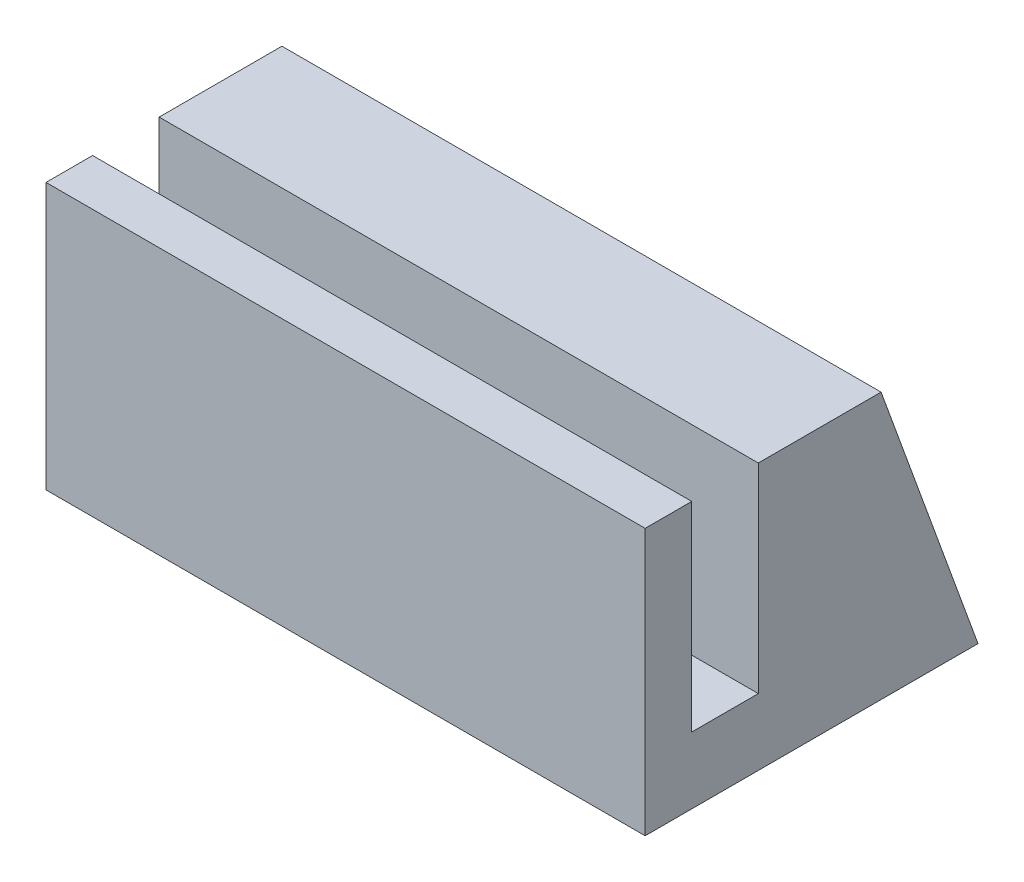
ISO-10303-21;
HEADER;
FILE_DESCRIPTION(('STEP AP214'),'2;1');
FILE_NAME('part.step','',(''),(''),'','','');
FILE_SCHEMA(('AUTOMOTIVE_DESIGN { 1 0 10303 214 1 1 1 1 }'));
ENDSEC;
DATA;
#1=APPLICATION_CONTEXT('core data for automotive mechanical design processes');
#2=APPLICATION_PROTOCOL_DEFINITION('international standard','automotive_design',2000,#1);
#3=PRODUCT_CONTEXT('',#1,'mechanical');
#4=PRODUCT('Part','Part','',(#3));
#5=PRODUCT_RELATED_PRODUCT_CATEGORY('part','',(#4));
#6=PRODUCT_DEFINITION_FORMATION('','',#4);
#7=PRODUCT_DEFINITION_CONTEXT('part definition',#1,'design');
#8=PRODUCT_DEFINITION('design','',#6,#7);
#9=PRODUCT_DEFINITION_SHAPE('','',#8);
#10=(LENGTH_UNIT() NAMED_UNIT(*) SI_UNIT(.MILLI.,.METRE.));
#11=(NAMED_UNIT(*) PLANE_ANGLE_UNIT() SI_UNIT($,.RADIAN.));
#12=(NAMED_UNIT(*) SI_UNIT($,.STERADIAN.) SOLID_ANGLE_UNIT());
#13=UNCERTAINTY_MEASURE_WITH_UNIT(LENGTH_MEASURE(1.E-05),#10,'distance_accuracy_value','');
#14=(GEOMETRIC_REPRESENTATION_CONTEXT(3) GLOBAL_UNCERTAINTY_ASSIGNED_CONTEXT((#13)) GLOBAL_UNIT_ASSIGNED_CONTEXT((#10,
#11,#12)) REPRESENTATION_CONTEXT('',''));
#15=CARTESIAN_POINT('',(0.,0.,0.));
#16=DIRECTION('',(0.,0.,1.));
#17=DIRECTION('',(1.,0.,0.));
#18=AXIS2_PLACEMENT_3D('',#15,#16,#17);
#19=CARTESIAN_POINT('',(22.5,-10.,25.));
#20=DIRECTION('',(-1.,0.,0.));
#21=DIRECTION('',(0.,0.,1.));
#22=AXIS2_PLACEMENT_3D('',#19,#20,#21);
#23=PLANE('',#22);
#24=DIRECTION('',(0.,0.,-1.));
#25=VECTOR('',#24,1.);
#26=CARTESIAN_POINT('',(22.5,-10.,25.));
#27=LINE('',#26,#25);
#28=CARTESIAN_POINT('',(22.5,-10.,25.));
#29=VERTEX_POINT('',#28);
#30=CARTESIAN_POINT('',(22.5,-10.,0.));
#31=VERTEX_POINT('',#30);
#32=EDGE_CURVE('E235',#29,#31,#27,.T.);
#33=ORIENTED_EDGE('',*,*,#32,.T.);
#34=DIRECTION('',(0.,-0.939683630956786,-0.34204484166827));
#35=VECTOR('',#34,1.);
#36=CARTESIAN_POINT('',(22.5,10.,7.28));
#37=LINE('',#36,#35);
#38=CARTESIAN_POINT('',(22.5,10.,7.28));
#39=VERTEX_POINT('',#38);
#40=EDGE_CURVE('E174',#39,#31,#37,.T.);
#41=ORIENTED_EDGE('',*,*,#40,.F.);
#42=DIRECTION('',(0.,0.,-1.));
#43=VECTOR('',#42,1.);
#44=CARTESIAN_POINT('',(22.5,10.,25.));
#45=LINE('',#44,#43);
#46=CARTESIAN_POINT('',(22.5,10.,16.5));
#47=VERTEX_POINT('',#46);
#48=EDGE_CURVE('E47',#47,#39,#45,.T.);
#49=ORIENTED_EDGE('',*,*,#48,.F.);
#50=DIRECTION('',(0.,1.,0.));
#51=VECTOR('',#50,1.);
#52=CARTESIAN_POINT('',(22.5,-5.,16.5));
#53=LINE('',#52,#51);
#54=CARTESIAN_POINT('',(22.5,-5.,16.5));
#55=VERTEX_POINT('',#54);
#56=EDGE_CURVE('E213',#55,#47,#53,.T.);
#57=ORIENTED_EDGE('',*,*,#56,.F.);
#58=DIRECTION('',(0.,0.,-1.));
#59=VECTOR('',#58,1.);
#60=CARTESIAN_POINT('',(22.5,-5.,0.));
#61=LINE('',#60,#59);
#62=CARTESIAN_POINT('',(22.5,-5.,21.5));
#63=VERTEX_POINT('',#62);
#64=EDGE_CURVE('E197',#63,#55,#61,.T.);
#65=ORIENTED_EDGE('',*,*,#64,.F.);
#66=DIRECTION('',(0.,1.,0.));
#67=VECTOR('',#66,1.);
#68=CARTESIAN_POINT('',(22.5,-5.,21.5));
#69=LINE('',#68,#67);
#70=CARTESIAN_POINT('',(22.5,10.,21.5));
#71=VERTEX_POINT('',#70);
#72=EDGE_CURVE('E216',#63,#71,#69,.T.);
#73=ORIENTED_EDGE('',*,*,#72,.T.);
#74=CARTESIAN_POINT('',(22.5,10.,25.));
#75=VERTEX_POINT('',#74);
#76=EDGE_CURVE('E11',#75,#71,#45,.T.);
#77=ORIENTED_EDGE('',*,*,#76,.F.);
#78=DIRECTION('',(0.,1.,0.));
#79=VECTOR('',#78,1.);
#80=CARTESIAN_POINT('',(22.5,-10.,25.));
#81=LINE('',#80,#79);
#82=EDGE_CURVE('E222',#29,#75,#81,.T.);
#83=ORIENTED_EDGE('',*,*,#82,.F.);
#84=EDGE_LOOP('',(#33,#41,#49,#57,#65,#73,#77,#83));
#85=FACE_BOUND('',#84,.T.);
#86=ADVANCED_FACE('F39',(#85),#23,.F.);
#87=CARTESIAN_POINT('',(-22.5,10.,25.));
#88=DIRECTION('',(0.,-1.,0.));
#89=DIRECTION('',(0.,0.,-1.));
#90=AXIS2_PLACEMENT_3D('',#87,#88,#89);
#91=PLANE('',#90);
#92=ORIENTED_EDGE('',*,*,#48,.T.);
#93=DIRECTION('',(1.,0.,0.));
#94=VECTOR('',#93,1.);
#95=CARTESIAN_POINT('',(-43.7837590664807,10.,7.28));
#96=LINE('',#95,#94);
#97=CARTESIAN_POINT('',(-22.5,10.,7.28));
#98=VERTEX_POINT('',#97);
#99=EDGE_CURVE('E184',#98,#39,#96,.T.);
#100=ORIENTED_EDGE('',*,*,#99,.F.);
#101=DIRECTION('',(0.,0.,-1.));
#102=VECTOR('',#101,1.);
#103=CARTESIAN_POINT('',(-22.5,10.,25.));
#104=LINE('',#103,#102);
#105=CARTESIAN_POINT('',(-22.5,10.,16.5));
#106=VERTEX_POINT('',#105);
#107=EDGE_CURVE('E245',#106,#98,#104,.T.);
#108=ORIENTED_EDGE('',*,*,#107,.F.);
#109=DIRECTION('',(1.,0.,0.));
#110=VECTOR('',#109,1.);
#111=CARTESIAN_POINT('',(0.,10.,16.5));
#112=LINE('',#111,#110);
#113=EDGE_CURVE('E193',#106,#47,#112,.T.);
#114=ORIENTED_EDGE('',*,*,#113,.T.);
#115=EDGE_LOOP('',(#92,#100,#108,#114));
#116=FACE_BOUND('',#115,.T.);
#117=ADVANCED_FACE('F264',(#116),#91,.F.);
#118=CARTESIAN_POINT('',(-22.5,-10.,25.));
#119=DIRECTION('',(1.,0.,0.));
#120=DIRECTION('',(0.,0.,-1.));
#121=AXIS2_PLACEMENT_3D('',#118,#119,#120);
#122=PLANE('',#121);
#123=ORIENTED_EDGE('',*,*,#107,.T.);
#124=DIRECTION('',(0.,0.939683630956786,0.34204484166827));
#125=VECTOR('',#124,1.);
#126=CARTESIAN_POINT('',(-22.5,10.,7.28));
#127=LINE('',#126,#125);
#128=CARTESIAN_POINT('',(-22.5,-10.,0.));
#129=VERTEX_POINT('',#128);
#130=EDGE_CURVE('E180',#129,#98,#127,.T.);
#131=ORIENTED_EDGE('',*,*,#130,.F.);
#132=DIRECTION('',(0.,0.,-1.));
#133=VECTOR('',#132,1.);
#134=CARTESIAN_POINT('',(-22.5,-10.,25.));
#135=LINE('',#134,#133);
#136=CARTESIAN_POINT('',(-22.5,-10.,25.));
#137=VERTEX_POINT('',#136);
#138=EDGE_CURVE('E242',#137,#129,#135,.T.);
#139=ORIENTED_EDGE('',*,*,#138,.F.);
#140=DIRECTION('',(0.,-1.,0.));
#141=VECTOR('',#140,1.);
#142=CARTESIAN_POINT('',(-22.5,-10.,25.));
#143=LINE('',#142,#141);
#144=CARTESIAN_POINT('',(-22.5,10.,25.));
#145=VERTEX_POINT('',#144);
#146=EDGE_CURVE('E229',#145,#137,#143,.T.);
#147=ORIENTED_EDGE('',*,*,#146,.F.);
#148=CARTESIAN_POINT('',(-22.5,10.,21.5));
#149=VERTEX_POINT('',#148);
#150=EDGE_CURVE('E246',#145,#149,#104,.T.);
#151=ORIENTED_EDGE('',*,*,#150,.T.);
#152=DIRECTION('',(0.,1.,0.));
#153=VECTOR('',#152,1.);
#154=CARTESIAN_POINT('',(-22.5,-5.,21.5));
#155=LINE('',#154,#153);
#156=CARTESIAN_POINT('',(-22.5,-5.,21.5));
#157=VERTEX_POINT('',#156);
#158=EDGE_CURVE('E202',#157,#149,#155,.T.);
#159=ORIENTED_EDGE('',*,*,#158,.F.);
#160=DIRECTION('',(0.,0.,1.));
#161=VECTOR('',#160,1.);
#162=CARTESIAN_POINT('',(-22.5,-5.,0.));
#163=LINE('',#162,#161);
#164=CARTESIAN_POINT('',(-22.5,-5.,16.5));
#165=VERTEX_POINT('',#164);
#166=EDGE_CURVE('E189',#165,#157,#163,.T.);
#167=ORIENTED_EDGE('',*,*,#166,.F.);
#168=DIRECTION('',(0.,1.,0.));
#169=VECTOR('',#168,1.);
#170=CARTESIAN_POINT('',(-22.5,-5.,16.5));
#171=LINE('',#170,#169);
#172=EDGE_CURVE('E208',#165,#106,#171,.T.);
#173=ORIENTED_EDGE('',*,*,#172,.T.);
#174=EDGE_LOOP('',(#123,#131,#139,#147,#151,#159,#167,#173));
#175=FACE_BOUND('',#174,.T.);
#176=ADVANCED_FACE('F259',(#175),#122,.F.);
#177=ORIENTED_EDGE('',*,*,#76,.T.);
#178=DIRECTION('',(1.,0.,0.));
#179=VECTOR('',#178,1.);
#180=CARTESIAN_POINT('',(0.,10.,21.5));
#181=LINE('',#180,#179);
#182=EDGE_CURVE('E183',#149,#71,#181,.T.);
#183=ORIENTED_EDGE('',*,*,#182,.F.);
#184=ORIENTED_EDGE('',*,*,#150,.F.);
#185=DIRECTION('',(-1.,0.,0.));
#186=VECTOR('',#185,1.);
#187=CARTESIAN_POINT('',(-22.5,10.,25.));
#188=LINE('',#187,#186);
#189=EDGE_CURVE('E226',#75,#145,#188,.T.);
#190=ORIENTED_EDGE('',*,*,#189,.F.);
#191=EDGE_LOOP('',(#177,#183,#184,#190));
#192=FACE_BOUND('',#191,.T.);
#193=ADVANCED_FACE('F281',(#192),#91,.F.);
#194=CARTESIAN_POINT('',(-22.5,-10.,25.));
#195=DIRECTION('',(0.,1.,0.));
#196=DIRECTION('',(0.,0.,1.));
#197=AXIS2_PLACEMENT_3D('',#194,#195,#196);
#198=PLANE('',#197);
#199=DIRECTION('',(1.,0.,0.));
#200=VECTOR('',#199,1.);
#201=CARTESIAN_POINT('',(-22.5,-10.,0.));
#202=LINE('',#201,#200);
#203=EDGE_CURVE('E212',#129,#31,#202,.T.);
#204=ORIENTED_EDGE('',*,*,#203,.T.);
#205=ORIENTED_EDGE('',*,*,#32,.F.);
#206=DIRECTION('',(1.,0.,0.));
#207=VECTOR('',#206,1.);
#208=CARTESIAN_POINT('',(-22.5,-10.,25.));
#209=LINE('',#208,#207);
#210=EDGE_CURVE('E232',#137,#29,#209,.T.);
#211=ORIENTED_EDGE('',*,*,#210,.F.);
#212=ORIENTED_EDGE('',*,*,#138,.T.);
#213=EDGE_LOOP('',(#204,#205,#211,#212));
#214=FACE_BOUND('',#213,.T.);
#215=ADVANCED_FACE('F276',(#214),#198,.F.);
#216=CARTESIAN_POINT('',(0.,0.,25.));
#217=DIRECTION('',(0.,0.,-1.));
#218=DIRECTION('',(-1.,0.,0.));
#219=AXIS2_PLACEMENT_3D('',#216,#217,#218);
#220=PLANE('',#219);
#221=ORIENTED_EDGE('',*,*,#82,.T.);
#222=ORIENTED_EDGE('',*,*,#189,.T.);
#223=ORIENTED_EDGE('',*,*,#146,.T.);
#224=ORIENTED_EDGE('',*,*,#210,.T.);
#225=EDGE_LOOP('',(#221,#222,#223,#224));
#226=FACE_BOUND('',#225,.T.);
#227=ADVANCED_FACE('F278',(#226),#220,.F.);
#228=CARTESIAN_POINT('',(0.,-5.,16.5));
#229=DIRECTION('',(0.,0.,1.));
#230=DIRECTION('',(1.,0.,0.));
#231=AXIS2_PLACEMENT_3D('',#228,#229,#230);
#232=PLANE('',#231);
#233=ORIENTED_EDGE('',*,*,#113,.F.);
#234=ORIENTED_EDGE('',*,*,#172,.F.);
#235=DIRECTION('',(1.,0.,0.));
#236=VECTOR('',#235,1.);
#237=CARTESIAN_POINT('',(0.,-5.,16.5));
#238=LINE('',#237,#236);
#239=EDGE_CURVE('E62',#165,#55,#238,.T.);
#240=ORIENTED_EDGE('',*,*,#239,.T.);
#241=ORIENTED_EDGE('',*,*,#56,.T.);
#242=EDGE_LOOP('',(#233,#234,#240,#241));
#243=FACE_BOUND('',#242,.T.);
#244=ADVANCED_FACE('F294',(#243),#232,.T.);
#245=CARTESIAN_POINT('',(0.,-5.,21.5));
#246=DIRECTION('',(0.,0.,1.));
#247=DIRECTION('',(1.,0.,0.));
#248=AXIS2_PLACEMENT_3D('',#245,#246,#247);
#249=PLANE('',#248);
#250=ORIENTED_EDGE('',*,*,#182,.T.);
#251=ORIENTED_EDGE('',*,*,#72,.F.);
#252=DIRECTION('',(1.,0.,0.));
#253=VECTOR('',#252,1.);
#254=CARTESIAN_POINT('',(0.,-5.,21.5));
#255=LINE('',#254,#253);
#256=EDGE_CURVE('E192',#157,#63,#255,.T.);
#257=ORIENTED_EDGE('',*,*,#256,.F.);
#258=ORIENTED_EDGE('',*,*,#158,.T.);
#259=EDGE_LOOP('',(#250,#251,#257,#258));
#260=FACE_BOUND('',#259,.T.);
#261=ADVANCED_FACE('F283',(#260),#249,.F.);
#262=CARTESIAN_POINT('',(0.,-5.,0.));
#263=DIRECTION('',(0.,1.,0.));
#264=DIRECTION('',(0.,0.,1.));
#265=AXIS2_PLACEMENT_3D('',#262,#263,#264);
#266=PLANE('',#265);
#267=ORIENTED_EDGE('',*,*,#166,.T.);
#268=ORIENTED_EDGE('',*,*,#256,.T.);
#269=ORIENTED_EDGE('',*,*,#64,.T.);
#270=ORIENTED_EDGE('',*,*,#239,.F.);
#271=EDGE_LOOP('',(#267,#268,#269,#270));
#272=FACE_BOUND('',#271,.T.);
#273=ADVANCED_FACE('F285',(#272),#266,.T.);
#274=CARTESIAN_POINT('',(-43.7837590664807,10.,7.28));
#275=DIRECTION('',(0.,-0.34204484166827,0.939683630956786));
#276=DIRECTION('',(0.,-0.939683630956786,-0.34204484166827));
#277=AXIS2_PLACEMENT_3D('',#274,#275,#276);
#278=PLANE('',#277);
#279=DIRECTION('',(1.,0.,0.));
#280=VECTOR('',#279,1.);
#281=CARTESIAN_POINT('',(19.15,3.34053469147385,4.85595462769648));
#282=LINE('',#281,#280);
#283=CARTESIAN_POINT('',(-19.15,3.34053469147385,4.85595462769648));
#284=VERTEX_POINT('',#283);
#285=CARTESIAN_POINT('',(19.15,3.34053469147385,4.85595462769648));
#286=VERTEX_POINT('',#285);
#287=EDGE_CURVE('E165',#284,#286,#282,.T.);
#288=ORIENTED_EDGE('',*,*,#287,.F.);
#289=DIRECTION('',(0.,0.939683630956785,0.34204484166827));
#290=VECTOR('',#289,1.);
#291=CARTESIAN_POINT('',(-19.15,-5.68042816571129,1.57232414768109));
#292=LINE('',#291,#290);
#293=CARTESIAN_POINT('',(-19.15,-5.68042816571129,1.57232414768109));
#294=VERTEX_POINT('',#293);
#295=EDGE_CURVE('E54',#294,#284,#292,.T.);
#296=ORIENTED_EDGE('',*,*,#295,.F.);
#297=DIRECTION('',(-1.,0.,0.));
#298=VECTOR('',#297,1.);
#299=CARTESIAN_POINT('',(19.15,-5.68042816571129,1.57232414768109));
#300=LINE('',#299,#298);
#301=CARTESIAN_POINT('',(19.15,-5.68042816571129,1.57232414768109));
#302=VERTEX_POINT('',#301);
#303=EDGE_CURVE('E152',#302,#294,#300,.T.);
#304=ORIENTED_EDGE('',*,*,#303,.F.);
#305=DIRECTION('',(0.,-0.939683630956785,-0.34204484166827));
#306=VECTOR('',#305,1.);
#307=CARTESIAN_POINT('',(19.15,-5.68042816571129,1.57232414768109));
#308=LINE('',#307,#306);
#309=EDGE_CURVE('E156',#286,#302,#308,.T.);
#310=ORIENTED_EDGE('',*,*,#309,.F.);
#311=EDGE_LOOP('',(#288,#296,#304,#310));
#312=FACE_BOUND('',#311,.T.);
#313=ORIENTED_EDGE('',*,*,#130,.T.);
#314=ORIENTED_EDGE('',*,*,#99,.T.);
#315=ORIENTED_EDGE('',*,*,#40,.T.);
#316=ORIENTED_EDGE('',*,*,#203,.F.);
#317=EDGE_LOOP('',(#313,#314,#315,#316));
#318=FACE_BOUND('',#317,.T.);
#319=ADVANCED_FACE('F268',(#312,#318),#278,.F.);
#320=CARTESIAN_POINT('',(-19.15,-9.10087658239399,10.9691604572489));
#321=DIRECTION('',(-1.,0.,0.));
#322=DIRECTION('',(0.,0.,1.));
#323=AXIS2_PLACEMENT_3D('',#320,#321,#322);
#324=PLANE('',#323);
#325=ORIENTED_EDGE('',*,*,#295,.T.);
#326=DIRECTION('',(0.,0.34204484166827,-0.939683630956786));
#327=VECTOR('',#326,1.);
#328=CARTESIAN_POINT('',(-19.15,-0.0799137252088483,14.2527909372643));
#329=LINE('',#328,#327);
#330=CARTESIAN_POINT('',(-19.15,-0.0799137252088483,14.2527909372643));
#331=VERTEX_POINT('',#330);
#332=EDGE_CURVE('E127',#331,#284,#329,.T.);
#333=ORIENTED_EDGE('',*,*,#332,.F.);
#334=DIRECTION('',(0.,0.939683630956785,0.34204484166827));
#335=VECTOR('',#334,1.);
#336=CARTESIAN_POINT('',(-19.15,-9.10087658239399,10.9691604572489));
#337=LINE('',#336,#335);
#338=CARTESIAN_POINT('',(-19.15,-9.10087658239399,10.9691604572489));
#339=VERTEX_POINT('',#338);
#340=EDGE_CURVE('E131',#339,#331,#337,.T.);
#341=ORIENTED_EDGE('',*,*,#340,.F.);
#342=DIRECTION('',(0.,0.34204484166827,-0.939683630956786));
#343=VECTOR('',#342,1.);
#344=CARTESIAN_POINT('',(-19.15,-9.10087658239399,10.9691604572489));
#345=LINE('',#344,#343);
#346=EDGE_CURVE('E171',#339,#294,#345,.T.);
#347=ORIENTED_EDGE('',*,*,#346,.T.);
#348=EDGE_LOOP('',(#325,#333,#341,#347));
#349=FACE_BOUND('',#348,.T.);
#350=ADVANCED_FACE('F129',(#349),#324,.F.);
#351=CARTESIAN_POINT('',(19.15,-9.10087658239399,10.9691604572489));
#352=DIRECTION('',(0.,-0.939683630956786,-0.34204484166827));
#353=DIRECTION('',(0.,0.34204484166827,-0.939683630956786));
#354=AXIS2_PLACEMENT_3D('',#351,#352,#353);
#355=PLANE('',#354);
#356=ORIENTED_EDGE('',*,*,#303,.T.);
#357=ORIENTED_EDGE('',*,*,#346,.F.);
#358=DIRECTION('',(-1.,0.,0.));
#359=VECTOR('',#358,1.);
#360=CARTESIAN_POINT('',(19.15,-9.10087658239399,10.9691604572489));
#361=LINE('',#360,#359);
#362=CARTESIAN_POINT('',(19.15,-9.10087658239399,10.9691604572489));
#363=VERTEX_POINT('',#362);
#364=EDGE_CURVE('E138',#363,#339,#361,.T.);
#365=ORIENTED_EDGE('',*,*,#364,.F.);
#366=DIRECTION('',(0.,0.34204484166827,-0.939683630956786));
#367=VECTOR('',#366,1.);
#368=CARTESIAN_POINT('',(19.15,-9.10087658239399,10.9691604572489));
#369=LINE('',#368,#367);
#370=EDGE_CURVE('E175',#363,#302,#369,.T.);
#371=ORIENTED_EDGE('',*,*,#370,.T.);
#372=EDGE_LOOP('',(#356,#357,#365,#371));
#373=FACE_BOUND('',#372,.T.);
#374=ADVANCED_FACE('F363',(#373),#355,.F.);
#375=CARTESIAN_POINT('',(19.15,-9.10087658239399,10.9691604572489));
#376=DIRECTION('',(1.,0.,0.));
#377=DIRECTION('',(0.,0.,-1.));
#378=AXIS2_PLACEMENT_3D('',#375,#376,#377);
#379=PLANE('',#378);
#380=ORIENTED_EDGE('',*,*,#309,.T.);
#381=ORIENTED_EDGE('',*,*,#370,.F.);
#382=DIRECTION('',(0.,-0.939683630956785,-0.34204484166827));
#383=VECTOR('',#382,1.);
#384=CARTESIAN_POINT('',(19.15,-9.10087658239399,10.9691604572489));
#385=LINE('',#384,#383);
#386=CARTESIAN_POINT('',(19.15,-0.0799137252088483,14.2527909372643));
#387=VERTEX_POINT('',#386);
#388=EDGE_CURVE('E147',#387,#363,#385,.T.);
#389=ORIENTED_EDGE('',*,*,#388,.F.);
#390=DIRECTION('',(0.,0.34204484166827,-0.939683630956786));
#391=VECTOR('',#390,1.);
#392=CARTESIAN_POINT('',(19.15,-0.0799137252088483,14.2527909372643));
#393=LINE('',#392,#391);
#394=EDGE_CURVE('E137',#387,#286,#393,.T.);
#395=ORIENTED_EDGE('',*,*,#394,.T.);
#396=EDGE_LOOP('',(#380,#381,#389,#395));
#397=FACE_BOUND('',#396,.T.);
#398=ADVANCED_FACE('F372',(#397),#379,.F.);
#399=CARTESIAN_POINT('',(19.15,-0.0799137252088483,14.2527909372643));
#400=DIRECTION('',(0.,0.939683630956786,0.34204484166827));
#401=DIRECTION('',(0.,-0.34204484166827,0.939683630956786));
#402=AXIS2_PLACEMENT_3D('',#399,#400,#401);
#403=PLANE('',#402);
#404=ORIENTED_EDGE('',*,*,#287,.T.);
#405=ORIENTED_EDGE('',*,*,#394,.F.);
#406=DIRECTION('',(1.,0.,0.));
#407=VECTOR('',#406,1.);
#408=CARTESIAN_POINT('',(19.15,-0.0799137252088483,14.2527909372643));
#409=LINE('',#408,#407);
#410=EDGE_CURVE('E141',#331,#387,#409,.T.);
#411=ORIENTED_EDGE('',*,*,#410,.F.);
#412=ORIENTED_EDGE('',*,*,#332,.T.);
#413=EDGE_LOOP('',(#404,#405,#411,#412));
#414=FACE_BOUND('',#413,.T.);
#415=ADVANCED_FACE('F142',(#414),#403,.F.);
#416=CARTESIAN_POINT('',(0.,-4.59039515380142,12.6109756972566));
#417=DIRECTION('',(0.,-0.34204484166827,0.939683630956785));
#418=DIRECTION('',(0.,-0.939683630956785,-0.34204484166827));
#419=AXIS2_PLACEMENT_3D('',#416,#417,#418);
#420=PLANE('',#419);
#421=ORIENTED_EDGE('',*,*,#340,.T.);
#422=ORIENTED_EDGE('',*,*,#410,.T.);
#423=ORIENTED_EDGE('',*,*,#388,.T.);
#424=ORIENTED_EDGE('',*,*,#364,.T.);
#425=EDGE_LOOP('',(#421,#422,#423,#424));
#426=FACE_BOUND('',#425,.T.);
#427=ADVANCED_FACE('F149',(#426),#420,.F.);
#428=CLOSED_SHELL('',(#86,#117,#176,#193,#215,#227,#244,#261,#273,#319,#350,#374,#398,#415,#427));
#429=MANIFOLD_SOLID_BREP('B2',#428);
#430=ADVANCED_BREP_SHAPE_REPRESENTATION('',(#18,#429),#14);
#431=SHAPE_DEFINITION_REPRESENTATION(#9,#430);
ENDSEC;
END-ISO-10303-21;
